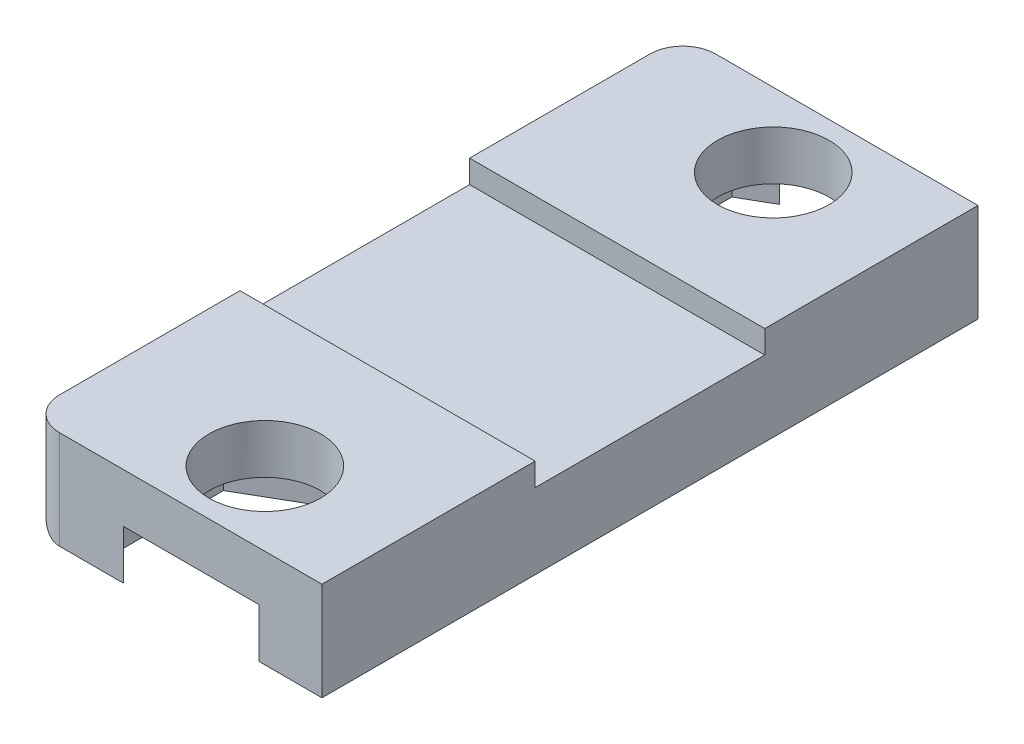
ISO-10303-21;
HEADER;
FILE_DESCRIPTION(('STEP AP214'),'2;1');
FILE_NAME('part.step','',(''),(''),'','','');
FILE_SCHEMA(('AUTOMOTIVE_DESIGN { 1 0 10303 214 1 1 1 1 }'));
ENDSEC;
DATA;
#1=APPLICATION_CONTEXT('core data for automotive mechanical design processes');
#2=APPLICATION_PROTOCOL_DEFINITION('international standard','automotive_design',2000,#1);
#3=PRODUCT_CONTEXT('',#1,'mechanical');
#4=PRODUCT('Part','Part','',(#3));
#5=PRODUCT_RELATED_PRODUCT_CATEGORY('part','',(#4));
#6=PRODUCT_DEFINITION_FORMATION('','',#4);
#7=PRODUCT_DEFINITION_CONTEXT('part definition',#1,'design');
#8=PRODUCT_DEFINITION('design','',#6,#7);
#9=PRODUCT_DEFINITION_SHAPE('','',#8);
#10=(LENGTH_UNIT() NAMED_UNIT(*) SI_UNIT(.MILLI.,.METRE.));
#11=(NAMED_UNIT(*) PLANE_ANGLE_UNIT() SI_UNIT($,.RADIAN.));
#12=(NAMED_UNIT(*) SI_UNIT($,.STERADIAN.) SOLID_ANGLE_UNIT());
#13=UNCERTAINTY_MEASURE_WITH_UNIT(LENGTH_MEASURE(1.E-05),#10,'distance_accuracy_value','');
#14=(GEOMETRIC_REPRESENTATION_CONTEXT(3) GLOBAL_UNCERTAINTY_ASSIGNED_CONTEXT((#13)) GLOBAL_UNIT_ASSIGNED_CONTEXT((#10,
#11,#12)) REPRESENTATION_CONTEXT('',''));
#15=CARTESIAN_POINT('',(0.,0.,0.));
#16=DIRECTION('',(0.,0.,1.));
#17=DIRECTION('',(1.,0.,0.));
#18=AXIS2_PLACEMENT_3D('',#15,#16,#17);
#19=CARTESIAN_POINT('',(169.955426616135,-1.,15.5));
#20=DIRECTION('',(0.,0.,1.));
#21=DIRECTION('',(1.,0.,0.));
#22=AXIS2_PLACEMENT_3D('',#19,#20,#21);
#23=PLANE('',#22);
#24=DIRECTION('',(1.,0.,0.));
#25=VECTOR('',#24,1.);
#26=CARTESIAN_POINT('',(169.954426616135,-0.7,15.5));
#27=LINE('',#26,#25);
#28=CARTESIAN_POINT('',(160.954426616135,-0.7,15.5));
#29=VERTEX_POINT('',#28);
#30=CARTESIAN_POINT('',(169.954426616135,-0.7,15.5));
#31=VERTEX_POINT('',#30);
#32=EDGE_CURVE('E55',#29,#31,#27,.T.);
#33=ORIENTED_EDGE('',*,*,#32,.F.);
#34=DIRECTION('',(0.,1.,0.));
#35=VECTOR('',#34,1.);
#36=CARTESIAN_POINT('',(160.954426616135,-1.,15.5));
#37=LINE('',#36,#35);
#38=CARTESIAN_POINT('',(160.954426616135,0.,15.5));
#39=VERTEX_POINT('',#38);
#40=EDGE_CURVE('E205',#29,#39,#37,.T.);
#41=ORIENTED_EDGE('',*,*,#40,.T.);
#42=DIRECTION('',(-1.,0.,0.));
#43=VECTOR('',#42,1.);
#44=CARTESIAN_POINT('',(169.955426616135,0.,15.5));
#45=LINE('',#44,#43);
#46=CARTESIAN_POINT('',(169.954426616135,0.,15.5));
#47=VERTEX_POINT('',#46);
#48=EDGE_CURVE('E204',#47,#39,#45,.T.);
#49=ORIENTED_EDGE('',*,*,#48,.F.);
#50=DIRECTION('',(0.,1.,0.));
#51=VECTOR('',#50,1.);
#52=CARTESIAN_POINT('',(169.954426616135,-1.,15.5));
#53=LINE('',#52,#51);
#54=EDGE_CURVE('E51',#31,#47,#53,.T.);
#55=ORIENTED_EDGE('',*,*,#54,.F.);
#56=EDGE_LOOP('',(#33,#41,#49,#55));
#57=FACE_BOUND('',#56,.T.);
#58=ADVANCED_FACE('F34',(#57),#23,.F.);
#59=CARTESIAN_POINT('',(169.955426616135,-1.,8.5));
#60=DIRECTION('',(0.,0.,-1.));
#61=DIRECTION('',(-1.,0.,0.));
#62=AXIS2_PLACEMENT_3D('',#59,#60,#61);
#63=PLANE('',#62);
#64=DIRECTION('',(-1.,0.,0.));
#65=VECTOR('',#64,1.);
#66=CARTESIAN_POINT('',(169.954426616135,-0.7,8.5));
#67=LINE('',#66,#65);
#68=CARTESIAN_POINT('',(169.954426616135,-0.7,8.5));
#69=VERTEX_POINT('',#68);
#70=CARTESIAN_POINT('',(160.954426616135,-0.7,8.5));
#71=VERTEX_POINT('',#70);
#72=EDGE_CURVE('E197',#69,#71,#67,.T.);
#73=ORIENTED_EDGE('',*,*,#72,.F.);
#74=DIRECTION('',(0.,-1.,0.));
#75=VECTOR('',#74,1.);
#76=CARTESIAN_POINT('',(169.954426616135,-1.,8.5));
#77=LINE('',#76,#75);
#78=CARTESIAN_POINT('',(169.954426616135,0.,8.5));
#79=VERTEX_POINT('',#78);
#80=EDGE_CURVE('E222',#79,#69,#77,.T.);
#81=ORIENTED_EDGE('',*,*,#80,.F.);
#82=DIRECTION('',(-1.,0.,0.));
#83=VECTOR('',#82,1.);
#84=CARTESIAN_POINT('',(169.955426616135,0.,8.5));
#85=LINE('',#84,#83);
#86=CARTESIAN_POINT('',(160.954426616135,0.,8.5));
#87=VERTEX_POINT('',#86);
#88=EDGE_CURVE('E200',#79,#87,#85,.T.);
#89=ORIENTED_EDGE('',*,*,#88,.T.);
#90=DIRECTION('',(0.,-1.,0.));
#91=VECTOR('',#90,1.);
#92=CARTESIAN_POINT('',(160.954426616135,-1.,8.5));
#93=LINE('',#92,#91);
#94=EDGE_CURVE('E194',#87,#71,#93,.T.);
#95=ORIENTED_EDGE('',*,*,#94,.T.);
#96=EDGE_LOOP('',(#73,#81,#89,#95));
#97=FACE_BOUND('',#96,.T.);
#98=ADVANCED_FACE('F196',(#97),#63,.F.);
#99=CARTESIAN_POINT('',(0.,0.,0.));
#100=DIRECTION('',(0.,1.,0.));
#101=DIRECTION('',(0.,0.,1.));
#102=AXIS2_PLACEMENT_3D('',#99,#100,#101);
#103=PLANE('',#102);
#104=DIRECTION('',(0.,0.,1.));
#105=VECTOR('',#104,1.);
#106=CARTESIAN_POINT('',(160.954426616135,0.,2.));
#107=LINE('',#106,#105);
#108=CARTESIAN_POINT('',(160.954426616135,0.,21.));
#109=VERTEX_POINT('',#108);
#110=EDGE_CURVE('E339',#39,#109,#107,.T.);
#111=ORIENTED_EDGE('',*,*,#110,.T.);
#112=CARTESIAN_POINT('',(161.954426616135,0.,21.));
#113=DIRECTION('',(0.,1.,0.));
#114=DIRECTION('',(0.,0.,1.));
#115=AXIS2_PLACEMENT_3D('',#112,#113,#114);
#116=CIRCLE('',#115,1.);
#117=CARTESIAN_POINT('',(161.954426616135,0.,22.));
#118=VERTEX_POINT('',#117);
#119=EDGE_CURVE('E43',#109,#118,#116,.T.);
#120=ORIENTED_EDGE('',*,*,#119,.T.);
#121=DIRECTION('',(1.,0.,0.));
#122=VECTOR('',#121,1.);
#123=CARTESIAN_POINT('',(160.954426616135,0.,22.));
#124=LINE('',#123,#122);
#125=CARTESIAN_POINT('',(169.954426616135,0.,22.));
#126=VERTEX_POINT('',#125);
#127=EDGE_CURVE('E353',#118,#126,#124,.T.);
#128=ORIENTED_EDGE('',*,*,#127,.T.);
#129=DIRECTION('',(0.,0.,-1.));
#130=VECTOR('',#129,1.);
#131=CARTESIAN_POINT('',(169.954426616135,0.,2.));
#132=LINE('',#131,#130);
#133=EDGE_CURVE('E356',#126,#47,#132,.T.);
#134=ORIENTED_EDGE('',*,*,#133,.T.);
#135=ORIENTED_EDGE('',*,*,#48,.T.);
#136=EDGE_LOOP('',(#111,#120,#128,#134,#135));
#137=FACE_BOUND('',#136,.T.);
#138=CARTESIAN_POINT('',(165.962302832178,0.,19.75));
#139=DIRECTION('',(0.,1.,0.));
#140=DIRECTION('',(0.,0.,1.));
#141=AXIS2_PLACEMENT_3D('',#138,#139,#140);
#142=CIRCLE('',#141,1.70000000000001);
#143=CARTESIAN_POINT('',(165.962302832178,0.,21.45));
#144=VERTEX_POINT('',#143);
#145=EDGE_CURVE('E333',#144,#144,#142,.T.);
#146=ORIENTED_EDGE('',*,*,#145,.F.);
#147=EDGE_LOOP('',(#146));
#148=FACE_BOUND('',#147,.T.);
#149=ADVANCED_FACE('F482',(#137,#148),#103,.T.);
#150=CARTESIAN_POINT('',(165.962302832178,-3.,19.75));
#151=DIRECTION('',(0.,1.,0.));
#152=DIRECTION('',(0.,0.,1.));
#153=AXIS2_PLACEMENT_3D('',#150,#151,#152);
#154=CYLINDRICAL_SURFACE('',#153,1.70000000000001);
#155=ORIENTED_EDGE('',*,*,#145,.T.);
#156=EDGE_LOOP('',(#155));
#157=FACE_BOUND('',#156,.T.);
#158=CARTESIAN_POINT('',(165.962302832178,-1.5,19.75));
#159=DIRECTION('',(0.,-1.,0.));
#160=DIRECTION('',(0.,0.,-1.));
#161=AXIS2_PLACEMENT_3D('',#158,#159,#160);
#162=CIRCLE('',#161,1.70000000000001);
#163=CARTESIAN_POINT('',(165.962302832178,-1.5,18.05));
#164=VERTEX_POINT('',#163);
#165=EDGE_CURVE('E315',#164,#164,#162,.F.);
#166=ORIENTED_EDGE('',*,*,#165,.F.);
#167=EDGE_LOOP('',(#166));
#168=FACE_BOUND('',#167,.T.);
#169=ADVANCED_FACE('F519',(#157,#168),#154,.F.);
#170=CARTESIAN_POINT('',(160.954426616135,-3.,2.));
#171=DIRECTION('',(-1.,0.,0.));
#172=DIRECTION('',(0.,0.,1.));
#173=AXIS2_PLACEMENT_3D('',#170,#171,#172);
#174=PLANE('',#173);
#175=ORIENTED_EDGE('',*,*,#40,.F.);
#176=DIRECTION('',(0.,0.,1.));
#177=VECTOR('',#176,1.);
#178=CARTESIAN_POINT('',(160.954426616135,-0.7,8.5));
#179=LINE('',#178,#177);
#180=EDGE_CURVE('E211',#71,#29,#179,.T.);
#181=ORIENTED_EDGE('',*,*,#180,.F.);
#182=ORIENTED_EDGE('',*,*,#94,.F.);
#183=CARTESIAN_POINT('',(160.954426616135,0.,3.));
#184=VERTEX_POINT('',#183);
#185=EDGE_CURVE('E351',#184,#87,#107,.T.);
#186=ORIENTED_EDGE('',*,*,#185,.F.);
#187=DIRECTION('',(0.,1.,0.));
#188=VECTOR('',#187,1.);
#189=CARTESIAN_POINT('',(160.954426616135,-3.,3.));
#190=LINE('',#189,#188);
#191=CARTESIAN_POINT('',(160.954426616135,-2.,3.));
#192=VERTEX_POINT('',#191);
#193=EDGE_CURVE('E376',#184,#192,#190,.F.);
#194=ORIENTED_EDGE('',*,*,#193,.T.);
#195=DIRECTION('',(0.,0.,1.));
#196=VECTOR('',#195,1.);
#197=CARTESIAN_POINT('',(160.954426616135,-2.,22.));
#198=LINE('',#197,#196);
#199=CARTESIAN_POINT('',(160.954426616135,-2.,21.));
#200=VERTEX_POINT('',#199);
#201=EDGE_CURVE('E373',#192,#200,#198,.T.);
#202=ORIENTED_EDGE('',*,*,#201,.T.);
#203=DIRECTION('',(0.,1.,0.));
#204=VECTOR('',#203,1.);
#205=CARTESIAN_POINT('',(160.954426616135,-3.,21.));
#206=LINE('',#205,#204);
#207=EDGE_CURVE('E365',#200,#109,#206,.T.);
#208=ORIENTED_EDGE('',*,*,#207,.T.);
#209=ORIENTED_EDGE('',*,*,#110,.F.);
#210=EDGE_LOOP('',(#175,#181,#182,#186,#194,#202,#208,#209));
#211=FACE_BOUND('',#210,.T.);
#212=ADVANCED_FACE('F215',(#211),#174,.T.);
#213=CARTESIAN_POINT('',(160.954426616135,-3.,2.));
#214=DIRECTION('',(0.,0.,-1.));
#215=DIRECTION('',(-1.,0.,0.));
#216=AXIS2_PLACEMENT_3D('',#213,#214,#215);
#217=PLANE('',#216);
#218=DIRECTION('',(-1.,0.,0.));
#219=VECTOR('',#218,1.);
#220=CARTESIAN_POINT('',(160.954426616135,-3.,2.));
#221=LINE('',#220,#219);
#222=CARTESIAN_POINT('',(163.896382905633,-3.,2.));
#223=VERTEX_POINT('',#222);
#224=CARTESIAN_POINT('',(161.954426616135,-3.,2.));
#225=VERTEX_POINT('',#224);
#226=EDGE_CURVE('E346',#223,#225,#221,.T.);
#227=ORIENTED_EDGE('',*,*,#226,.T.);
#228=DIRECTION('',(0.,1.,0.));
#229=VECTOR('',#228,1.);
#230=CARTESIAN_POINT('',(161.954426616135,-3.,2.));
#231=LINE('',#230,#229);
#232=CARTESIAN_POINT('',(161.954426616135,0.,2.));
#233=VERTEX_POINT('',#232);
#234=EDGE_CURVE('E380',#225,#233,#231,.T.);
#235=ORIENTED_EDGE('',*,*,#234,.T.);
#236=DIRECTION('',(-1.,0.,0.));
#237=VECTOR('',#236,1.);
#238=CARTESIAN_POINT('',(160.954426616135,0.,2.));
#239=LINE('',#238,#237);
#240=CARTESIAN_POINT('',(169.954426616135,0.,2.));
#241=VERTEX_POINT('',#240);
#242=EDGE_CURVE('E359',#241,#233,#239,.T.);
#243=ORIENTED_EDGE('',*,*,#242,.F.);
#244=DIRECTION('',(0.,1.,0.));
#245=VECTOR('',#244,1.);
#246=CARTESIAN_POINT('',(169.954426616135,-3.,2.));
#247=LINE('',#246,#245);
#248=CARTESIAN_POINT('',(169.954426616135,-3.,2.));
#249=VERTEX_POINT('',#248);
#250=EDGE_CURVE('E362',#249,#241,#247,.T.);
#251=ORIENTED_EDGE('',*,*,#250,.F.);
#252=CARTESIAN_POINT('',(168.028222758723,-3.,2.00000000000001));
#253=VERTEX_POINT('',#252);
#254=EDGE_CURVE('E347',#249,#253,#221,.T.);
#255=ORIENTED_EDGE('',*,*,#254,.T.);
#256=DIRECTION('',(0.,-1.,0.));
#257=VECTOR('',#256,1.);
#258=CARTESIAN_POINT('',(168.028222758723,-3.,2.));
#259=LINE('',#258,#257);
#260=CARTESIAN_POINT('',(168.028222758723,-1.5,2.));
#261=VERTEX_POINT('',#260);
#262=EDGE_CURVE('E278',#261,#253,#259,.T.);
#263=ORIENTED_EDGE('',*,*,#262,.F.);
#264=DIRECTION('',(1.,0.,0.));
#265=VECTOR('',#264,1.);
#266=CARTESIAN_POINT('',(160.954426616135,-1.5,2.));
#267=LINE('',#266,#265);
#268=CARTESIAN_POINT('',(163.896382905633,-1.5,2.));
#269=VERTEX_POINT('',#268);
#270=EDGE_CURVE('E274',#269,#261,#267,.T.);
#271=ORIENTED_EDGE('',*,*,#270,.F.);
#272=DIRECTION('',(0.,1.,0.));
#273=VECTOR('',#272,1.);
#274=CARTESIAN_POINT('',(163.896382905633,-3.,2.));
#275=LINE('',#274,#273);
#276=EDGE_CURVE('E276',#223,#269,#275,.T.);
#277=ORIENTED_EDGE('',*,*,#276,.F.);
#278=EDGE_LOOP('',(#227,#235,#243,#251,#255,#263,#271,#277));
#279=FACE_BOUND('',#278,.T.);
#280=ADVANCED_FACE('F399',(#279),#217,.T.);
#281=CARTESIAN_POINT('',(169.954426616135,-3.,2.));
#282=DIRECTION('',(1.,0.,0.));
#283=DIRECTION('',(0.,0.,-1.));
#284=AXIS2_PLACEMENT_3D('',#281,#282,#283);
#285=PLANE('',#284);
#286=DIRECTION('',(0.,0.,-1.));
#287=VECTOR('',#286,1.);
#288=CARTESIAN_POINT('',(169.954426616135,-0.7,8.5));
#289=LINE('',#288,#287);
#290=EDGE_CURVE('E213',#31,#69,#289,.T.);
#291=ORIENTED_EDGE('',*,*,#290,.F.);
#292=ORIENTED_EDGE('',*,*,#54,.T.);
#293=ORIENTED_EDGE('',*,*,#133,.F.);
#294=DIRECTION('',(0.,1.,0.));
#295=VECTOR('',#294,1.);
#296=CARTESIAN_POINT('',(169.954426616135,-3.,22.));
#297=LINE('',#296,#295);
#298=CARTESIAN_POINT('',(169.954426616135,-3.,22.));
#299=VERTEX_POINT('',#298);
#300=EDGE_CURVE('E350',#299,#126,#297,.T.);
#301=ORIENTED_EDGE('',*,*,#300,.F.);
#302=DIRECTION('',(0.,0.,-1.));
#303=VECTOR('',#302,1.);
#304=CARTESIAN_POINT('',(169.954426616135,-3.,2.));
#305=LINE('',#304,#303);
#306=EDGE_CURVE('E342',#299,#249,#305,.T.);
#307=ORIENTED_EDGE('',*,*,#306,.T.);
#308=ORIENTED_EDGE('',*,*,#250,.T.);
#309=EDGE_CURVE('E355',#79,#241,#132,.T.);
#310=ORIENTED_EDGE('',*,*,#309,.F.);
#311=ORIENTED_EDGE('',*,*,#80,.T.);
#312=EDGE_LOOP('',(#291,#292,#293,#301,#307,#308,#310,#311));
#313=FACE_BOUND('',#312,.T.);
#314=ADVANCED_FACE('F407',(#313),#285,.T.);
#315=CARTESIAN_POINT('',(160.954426616135,-3.,22.));
#316=DIRECTION('',(0.,0.,1.));
#317=DIRECTION('',(1.,0.,0.));
#318=AXIS2_PLACEMENT_3D('',#315,#316,#317);
#319=PLANE('',#318);
#320=ORIENTED_EDGE('',*,*,#127,.F.);
#321=DIRECTION('',(0.,1.,0.));
#322=VECTOR('',#321,1.);
#323=CARTESIAN_POINT('',(161.954426616135,-3.,22.));
#324=LINE('',#323,#322);
#325=CARTESIAN_POINT('',(161.954426616135,-3.,22.));
#326=VERTEX_POINT('',#325);
#327=EDGE_CURVE('E11',#118,#326,#324,.F.);
#328=ORIENTED_EDGE('',*,*,#327,.T.);
#329=DIRECTION('',(1.,0.,0.));
#330=VECTOR('',#329,1.);
#331=CARTESIAN_POINT('',(160.954426616135,-3.,22.));
#332=LINE('',#331,#330);
#333=CARTESIAN_POINT('',(163.896382905633,-3.,22.));
#334=VERTEX_POINT('',#333);
#335=EDGE_CURVE('E340',#326,#334,#332,.T.);
#336=ORIENTED_EDGE('',*,*,#335,.T.);
#337=DIRECTION('',(0.,-1.,0.));
#338=VECTOR('',#337,1.);
#339=CARTESIAN_POINT('',(163.896382905633,-3.,22.));
#340=LINE('',#339,#338);
#341=CARTESIAN_POINT('',(163.896382905633,-1.5,22.));
#342=VERTEX_POINT('',#341);
#343=EDGE_CURVE('E330',#342,#334,#340,.T.);
#344=ORIENTED_EDGE('',*,*,#343,.F.);
#345=DIRECTION('',(1.,0.,0.));
#346=VECTOR('',#345,1.);
#347=CARTESIAN_POINT('',(160.954426616135,-1.5,22.));
#348=LINE('',#347,#346);
#349=CARTESIAN_POINT('',(168.028222758723,-1.5,22.));
#350=VERTEX_POINT('',#349);
#351=EDGE_CURVE('E325',#342,#350,#348,.T.);
#352=ORIENTED_EDGE('',*,*,#351,.T.);
#353=DIRECTION('',(0.,1.,0.));
#354=VECTOR('',#353,1.);
#355=CARTESIAN_POINT('',(168.028222758723,-3.,22.));
#356=LINE('',#355,#354);
#357=CARTESIAN_POINT('',(168.028222758723,-3.,22.));
#358=VERTEX_POINT('',#357);
#359=EDGE_CURVE('E328',#358,#350,#356,.T.);
#360=ORIENTED_EDGE('',*,*,#359,.F.);
#361=EDGE_CURVE('E343',#358,#299,#332,.T.);
#362=ORIENTED_EDGE('',*,*,#361,.T.);
#363=ORIENTED_EDGE('',*,*,#300,.T.);
#364=EDGE_LOOP('',(#320,#328,#336,#344,#352,#360,#362,#363));
#365=FACE_BOUND('',#364,.T.);
#366=ADVANCED_FACE('F440',(#365),#319,.T.);
#367=CARTESIAN_POINT('',(0.,-3.,0.));
#368=DIRECTION('',(0.,1.,0.));
#369=DIRECTION('',(0.,0.,1.));
#370=AXIS2_PLACEMENT_3D('',#367,#368,#369);
#371=PLANE('',#370);
#372=ORIENTED_EDGE('',*,*,#335,.F.);
#373=DIRECTION('',(0.,0.,1.));
#374=VECTOR('',#373,1.);
#375=CARTESIAN_POINT('',(161.954426616135,-3.,2.));
#376=LINE('',#375,#374);
#377=EDGE_CURVE('E378',#326,#225,#376,.F.);
#378=ORIENTED_EDGE('',*,*,#377,.T.);
#379=ORIENTED_EDGE('',*,*,#226,.F.);
#380=DIRECTION('',(0.86602540378444,0.,-0.499999999999998));
#381=VECTOR('',#380,1.);
#382=CARTESIAN_POINT('',(165.962302832178,-3.,0.80724057428494));
#383=LINE('',#382,#381);
#384=CARTESIAN_POINT('',(162.98078571039,-3.,2.52862028714248));
#385=VERTEX_POINT('',#384);
#386=EDGE_CURVE('E256',#385,#223,#383,.T.);
#387=ORIENTED_EDGE('',*,*,#386,.F.);
#388=DIRECTION('',(0.,0.,-1.));
#389=VECTOR('',#388,1.);
#390=CARTESIAN_POINT('',(162.98078571039,-3.,2.52862028714248));
#391=LINE('',#390,#389);
#392=CARTESIAN_POINT('',(162.98078571039,-3.,5.97137971285751));
#393=VERTEX_POINT('',#392);
#394=EDGE_CURVE('E253',#393,#385,#391,.T.);
#395=ORIENTED_EDGE('',*,*,#394,.F.);
#396=DIRECTION('',(-0.866025403784439,0.,-0.5));
#397=VECTOR('',#396,1.);
#398=CARTESIAN_POINT('',(162.98078571039,-3.,5.97137971285751));
#399=LINE('',#398,#397);
#400=CARTESIAN_POINT('',(165.962302832178,-3.,7.69275942571507));
#401=VERTEX_POINT('',#400);
#402=EDGE_CURVE('E250',#401,#393,#399,.T.);
#403=ORIENTED_EDGE('',*,*,#402,.F.);
#404=DIRECTION('',(-0.866025403784439,0.,0.5));
#405=VECTOR('',#404,1.);
#406=CARTESIAN_POINT('',(165.962302832178,-3.,7.69275942571506));
#407=LINE('',#406,#405);
#408=CARTESIAN_POINT('',(168.943819953965,-3.,5.97137971285753));
#409=VERTEX_POINT('',#408);
#410=EDGE_CURVE('E227',#409,#401,#407,.T.);
#411=ORIENTED_EDGE('',*,*,#410,.F.);
#412=DIRECTION('',(0.,0.,1.));
#413=VECTOR('',#412,1.);
#414=CARTESIAN_POINT('',(168.943819953965,-3.,5.97137971285753));
#415=LINE('',#414,#413);
#416=CARTESIAN_POINT('',(168.943819953965,-3.,2.52862028714248));
#417=VERTEX_POINT('',#416);
#418=EDGE_CURVE('E234',#417,#409,#415,.T.);
#419=ORIENTED_EDGE('',*,*,#418,.F.);
#420=DIRECTION('',(0.866025403784438,0.,0.500000000000001));
#421=VECTOR('',#420,1.);
#422=CARTESIAN_POINT('',(168.943819953965,-3.,2.52862028714248));
#423=LINE('',#422,#421);
#424=EDGE_CURVE('E258',#253,#417,#423,.T.);
#425=ORIENTED_EDGE('',*,*,#424,.F.);
#426=ORIENTED_EDGE('',*,*,#254,.F.);
#427=ORIENTED_EDGE('',*,*,#306,.F.);
#428=ORIENTED_EDGE('',*,*,#361,.F.);
#429=DIRECTION('',(-0.866025403784438,0.,0.500000000000001));
#430=VECTOR('',#429,1.);
#431=CARTESIAN_POINT('',(168.943819953965,-3.,21.4713797128575));
#432=LINE('',#431,#430);
#433=CARTESIAN_POINT('',(168.943819953965,-3.,21.4713797128575));
#434=VERTEX_POINT('',#433);
#435=EDGE_CURVE('E301',#434,#358,#432,.T.);
#436=ORIENTED_EDGE('',*,*,#435,.F.);
#437=DIRECTION('',(0.,0.,1.));
#438=VECTOR('',#437,1.);
#439=CARTESIAN_POINT('',(168.943819953965,-3.,18.0286202871425));
#440=LINE('',#439,#438);
#441=CARTESIAN_POINT('',(168.943819953965,-3.,18.0286202871425));
#442=VERTEX_POINT('',#441);
#443=EDGE_CURVE('E280',#442,#434,#440,.T.);
#444=ORIENTED_EDGE('',*,*,#443,.F.);
#445=DIRECTION('',(0.866025403784439,0.,0.5));
#446=VECTOR('',#445,1.);
#447=CARTESIAN_POINT('',(165.962302832178,-3.,16.3072405742849));
#448=LINE('',#447,#446);
#449=CARTESIAN_POINT('',(165.962302832178,-3.,16.3072405742849));
#450=VERTEX_POINT('',#449);
#451=EDGE_CURVE('E285',#450,#442,#448,.T.);
#452=ORIENTED_EDGE('',*,*,#451,.F.);
#453=DIRECTION('',(0.866025403784439,0.,-0.5));
#454=VECTOR('',#453,1.);
#455=CARTESIAN_POINT('',(162.98078571039,-3.,18.0286202871425));
#456=LINE('',#455,#454);
#457=CARTESIAN_POINT('',(162.98078571039,-3.,18.0286202871425));
#458=VERTEX_POINT('',#457);
#459=EDGE_CURVE('E308',#458,#450,#456,.T.);
#460=ORIENTED_EDGE('',*,*,#459,.F.);
#461=DIRECTION('',(0.,0.,-1.));
#462=VECTOR('',#461,1.);
#463=CARTESIAN_POINT('',(162.98078571039,-3.,21.4713797128575));
#464=LINE('',#463,#462);
#465=CARTESIAN_POINT('',(162.98078571039,-3.,21.4713797128575));
#466=VERTEX_POINT('',#465);
#467=EDGE_CURVE('E305',#466,#458,#464,.T.);
#468=ORIENTED_EDGE('',*,*,#467,.F.);
#469=DIRECTION('',(-0.86602540378444,0.,-0.499999999999998));
#470=VECTOR('',#469,1.);
#471=CARTESIAN_POINT('',(165.962302832178,-3.,23.1927594257151));
#472=LINE('',#471,#470);
#473=EDGE_CURVE('E303',#334,#466,#472,.T.);
#474=ORIENTED_EDGE('',*,*,#473,.F.);
#475=EDGE_LOOP('',(#372,#378,#379,#387,#395,#403,#411,#419,#425,#426,#427,#428,#436,#444,#452,
#460,#468,#474));
#476=FACE_BOUND('',#475,.T.);
#477=ADVANCED_FACE('F416',(#476),#371,.F.);
#478=ORIENTED_EDGE('',*,*,#242,.T.);
#479=CARTESIAN_POINT('',(161.954426616135,0.,3.));
#480=DIRECTION('',(0.,1.,0.));
#481=DIRECTION('',(0.,0.,1.));
#482=AXIS2_PLACEMENT_3D('',#479,#480,#481);
#483=CIRCLE('',#482,1.);
#484=EDGE_CURVE('E382',#233,#184,#483,.T.);
#485=ORIENTED_EDGE('',*,*,#484,.T.);
#486=ORIENTED_EDGE('',*,*,#185,.T.);
#487=ORIENTED_EDGE('',*,*,#88,.F.);
#488=ORIENTED_EDGE('',*,*,#309,.T.);
#489=EDGE_LOOP('',(#478,#485,#486,#487,#488));
#490=FACE_BOUND('',#489,.T.);
#491=CARTESIAN_POINT('',(165.962302832178,0.,4.24999999999999));
#492=DIRECTION('',(0.,1.,0.));
#493=DIRECTION('',(0.,0.,1.));
#494=AXIS2_PLACEMENT_3D('',#491,#492,#493);
#495=CIRCLE('',#494,1.70000000000001);
#496=CARTESIAN_POINT('',(165.962302832178,0.,5.95));
#497=VERTEX_POINT('',#496);
#498=EDGE_CURVE('E336',#497,#497,#495,.T.);
#499=ORIENTED_EDGE('',*,*,#498,.F.);
#500=EDGE_LOOP('',(#499));
#501=FACE_BOUND('',#500,.T.);
#502=ADVANCED_FACE('F403',(#490,#501),#103,.T.);
#503=CARTESIAN_POINT('',(165.962302832178,-3.,4.24999999999999));
#504=DIRECTION('',(0.,1.,0.));
#505=DIRECTION('',(0.,0.,1.));
#506=AXIS2_PLACEMENT_3D('',#503,#504,#505);
#507=CYLINDRICAL_SURFACE('',#506,1.70000000000001);
#508=CARTESIAN_POINT('',(165.962302832178,-1.5,4.24999999999999));
#509=DIRECTION('',(0.,1.,0.));
#510=DIRECTION('',(0.,0.,1.));
#511=AXIS2_PLACEMENT_3D('',#508,#509,#510);
#512=CIRCLE('',#511,1.70000000000001);
#513=CARTESIAN_POINT('',(165.962302832178,-1.5,5.95));
#514=VERTEX_POINT('',#513);
#515=EDGE_CURVE('E264',#514,#514,#512,.F.);
#516=ORIENTED_EDGE('',*,*,#515,.T.);
#517=EDGE_LOOP('',(#516));
#518=FACE_BOUND('',#517,.T.);
#519=ORIENTED_EDGE('',*,*,#498,.T.);
#520=EDGE_LOOP('',(#519));
#521=FACE_BOUND('',#520,.T.);
#522=ADVANCED_FACE('F509',(#518,#521),#507,.F.);
#523=CARTESIAN_POINT('',(0.,-1.5,0.));
#524=DIRECTION('',(0.,-1.,0.));
#525=DIRECTION('',(0.,0.,-1.));
#526=AXIS2_PLACEMENT_3D('',#523,#524,#525);
#527=PLANE('',#526);
#528=DIRECTION('',(-0.86602540378444,0.,-0.499999999999998));
#529=VECTOR('',#528,1.);
#530=CARTESIAN_POINT('',(165.962302832178,-1.5,23.1927594257151));
#531=LINE('',#530,#529);
#532=CARTESIAN_POINT('',(162.98078571039,-1.5,21.4713797128575));
#533=VERTEX_POINT('',#532);
#534=EDGE_CURVE('E288',#342,#533,#531,.T.);
#535=ORIENTED_EDGE('',*,*,#534,.T.);
#536=DIRECTION('',(0.,0.,-1.));
#537=VECTOR('',#536,1.);
#538=CARTESIAN_POINT('',(162.98078571039,-1.5,21.4713797128575));
#539=LINE('',#538,#537);
#540=CARTESIAN_POINT('',(162.98078571039,-1.5,18.0286202871425));
#541=VERTEX_POINT('',#540);
#542=EDGE_CURVE('E290',#533,#541,#539,.T.);
#543=ORIENTED_EDGE('',*,*,#542,.T.);
#544=DIRECTION('',(0.866025403784439,0.,-0.5));
#545=VECTOR('',#544,1.);
#546=CARTESIAN_POINT('',(162.98078571039,-1.5,18.0286202871425));
#547=LINE('',#546,#545);
#548=CARTESIAN_POINT('',(165.962302832178,-1.5,16.3072405742849));
#549=VERTEX_POINT('',#548);
#550=EDGE_CURVE('E293',#541,#549,#547,.T.);
#551=ORIENTED_EDGE('',*,*,#550,.T.);
#552=DIRECTION('',(0.866025403784439,0.,0.5));
#553=VECTOR('',#552,1.);
#554=CARTESIAN_POINT('',(165.962302832178,-1.5,16.3072405742849));
#555=LINE('',#554,#553);
#556=CARTESIAN_POINT('',(168.943819953965,-1.5,18.0286202871425));
#557=VERTEX_POINT('',#556);
#558=EDGE_CURVE('E296',#549,#557,#555,.T.);
#559=ORIENTED_EDGE('',*,*,#558,.T.);
#560=DIRECTION('',(0.,0.,1.));
#561=VECTOR('',#560,1.);
#562=CARTESIAN_POINT('',(168.943819953965,-1.5,18.0286202871425));
#563=LINE('',#562,#561);
#564=CARTESIAN_POINT('',(168.943819953965,-1.5,21.4713797128575));
#565=VERTEX_POINT('',#564);
#566=EDGE_CURVE('E281',#557,#565,#563,.T.);
#567=ORIENTED_EDGE('',*,*,#566,.T.);
#568=DIRECTION('',(-0.866025403784438,0.,0.500000000000001));
#569=VECTOR('',#568,1.);
#570=CARTESIAN_POINT('',(168.943819953965,-1.5,21.4713797128575));
#571=LINE('',#570,#569);
#572=EDGE_CURVE('E284',#565,#350,#571,.T.);
#573=ORIENTED_EDGE('',*,*,#572,.T.);
#574=ORIENTED_EDGE('',*,*,#351,.F.);
#575=EDGE_LOOP('',(#535,#543,#551,#559,#567,#573,#574));
#576=FACE_BOUND('',#575,.T.);
#577=ORIENTED_EDGE('',*,*,#165,.T.);
#578=EDGE_LOOP('',(#577));
#579=FACE_BOUND('',#578,.T.);
#580=ADVANCED_FACE('F448',(#576,#579),#527,.T.);
#581=CARTESIAN_POINT('',(168.943819953965,-1.5,18.0286202871425));
#582=DIRECTION('',(1.,0.,0.));
#583=DIRECTION('',(0.,0.,-1.));
#584=AXIS2_PLACEMENT_3D('',#581,#582,#583);
#585=PLANE('',#584);
#586=ORIENTED_EDGE('',*,*,#443,.T.);
#587=DIRECTION('',(0.,-1.,0.));
#588=VECTOR('',#587,1.);
#589=CARTESIAN_POINT('',(168.943819953965,-1.5,21.4713797128575));
#590=LINE('',#589,#588);
#591=EDGE_CURVE('E299',#565,#434,#590,.T.);
#592=ORIENTED_EDGE('',*,*,#591,.F.);
#593=ORIENTED_EDGE('',*,*,#566,.F.);
#594=DIRECTION('',(0.,-1.,0.));
#595=VECTOR('',#594,1.);
#596=CARTESIAN_POINT('',(168.943819953965,-1.5,18.0286202871425));
#597=LINE('',#596,#595);
#598=EDGE_CURVE('E313',#557,#442,#597,.T.);
#599=ORIENTED_EDGE('',*,*,#598,.T.);
#600=EDGE_LOOP('',(#586,#592,#593,#599));
#601=FACE_BOUND('',#600,.T.);
#602=ADVANCED_FACE('F459',(#601),#585,.F.);
#603=CARTESIAN_POINT('',(165.962302832178,-1.5,16.3072405742849));
#604=DIRECTION('',(0.5,0.,-0.866025403784438));
#605=DIRECTION('',(-0.866025403784439,0.,-0.5));
#606=AXIS2_PLACEMENT_3D('',#603,#604,#605);
#607=PLANE('',#606);
#608=ORIENTED_EDGE('',*,*,#451,.T.);
#609=ORIENTED_EDGE('',*,*,#598,.F.);
#610=ORIENTED_EDGE('',*,*,#558,.F.);
#611=DIRECTION('',(0.,-1.,0.));
#612=VECTOR('',#611,1.);
#613=CARTESIAN_POINT('',(165.962302832178,-1.5,16.3072405742849));
#614=LINE('',#613,#612);
#615=EDGE_CURVE('E316',#549,#450,#614,.T.);
#616=ORIENTED_EDGE('',*,*,#615,.T.);
#617=EDGE_LOOP('',(#608,#609,#610,#616));
#618=FACE_BOUND('',#617,.T.);
#619=ADVANCED_FACE('F462',(#618),#607,.F.);
#620=CARTESIAN_POINT('',(162.98078571039,-1.5,18.0286202871425));
#621=DIRECTION('',(-0.5,0.,-0.866025403784439));
#622=DIRECTION('',(-0.866025403784439,0.,0.5));
#623=AXIS2_PLACEMENT_3D('',#620,#621,#622);
#624=PLANE('',#623);
#625=ORIENTED_EDGE('',*,*,#459,.T.);
#626=ORIENTED_EDGE('',*,*,#615,.F.);
#627=ORIENTED_EDGE('',*,*,#550,.F.);
#628=DIRECTION('',(0.,-1.,0.));
#629=VECTOR('',#628,1.);
#630=CARTESIAN_POINT('',(162.98078571039,-1.5,18.0286202871425));
#631=LINE('',#630,#629);
#632=EDGE_CURVE('E318',#541,#458,#631,.T.);
#633=ORIENTED_EDGE('',*,*,#632,.T.);
#634=EDGE_LOOP('',(#625,#626,#627,#633));
#635=FACE_BOUND('',#634,.T.);
#636=ADVANCED_FACE('F465',(#635),#624,.F.);
#637=CARTESIAN_POINT('',(162.98078571039,-1.5,21.4713797128575));
#638=DIRECTION('',(-1.,0.,0.));
#639=DIRECTION('',(0.,0.,1.));
#640=AXIS2_PLACEMENT_3D('',#637,#638,#639);
#641=PLANE('',#640);
#642=ORIENTED_EDGE('',*,*,#467,.T.);
#643=ORIENTED_EDGE('',*,*,#632,.F.);
#644=ORIENTED_EDGE('',*,*,#542,.F.);
#645=DIRECTION('',(0.,-1.,0.));
#646=VECTOR('',#645,1.);
#647=CARTESIAN_POINT('',(162.98078571039,-1.5,21.4713797128575));
#648=LINE('',#647,#646);
#649=EDGE_CURVE('E320',#533,#466,#648,.T.);
#650=ORIENTED_EDGE('',*,*,#649,.T.);
#651=EDGE_LOOP('',(#642,#643,#644,#650));
#652=FACE_BOUND('',#651,.T.);
#653=ADVANCED_FACE('F468',(#652),#641,.F.);
#654=CARTESIAN_POINT('',(165.962302832178,-1.5,23.1927594257151));
#655=DIRECTION('',(-0.499999999999998,0.,0.86602540378444));
#656=DIRECTION('',(0.86602540378444,0.,0.499999999999998));
#657=AXIS2_PLACEMENT_3D('',#654,#655,#656);
#658=PLANE('',#657);
#659=ORIENTED_EDGE('',*,*,#343,.T.);
#660=ORIENTED_EDGE('',*,*,#473,.T.);
#661=ORIENTED_EDGE('',*,*,#649,.F.);
#662=ORIENTED_EDGE('',*,*,#534,.F.);
#663=EDGE_LOOP('',(#659,#660,#661,#662));
#664=FACE_BOUND('',#663,.T.);
#665=ADVANCED_FACE('F444',(#664),#658,.F.);
#666=CARTESIAN_POINT('',(168.943819953965,-1.5,21.4713797128575));
#667=DIRECTION('',(0.500000000000001,0.,0.866025403784438));
#668=DIRECTION('',(0.866025403784438,0.,-0.500000000000001));
#669=AXIS2_PLACEMENT_3D('',#666,#667,#668);
#670=PLANE('',#669);
#671=ORIENTED_EDGE('',*,*,#359,.T.);
#672=ORIENTED_EDGE('',*,*,#572,.F.);
#673=ORIENTED_EDGE('',*,*,#591,.T.);
#674=ORIENTED_EDGE('',*,*,#435,.T.);
#675=EDGE_LOOP('',(#671,#672,#673,#674));
#676=FACE_BOUND('',#675,.T.);
#677=ADVANCED_FACE('F456',(#676),#670,.F.);
#678=CARTESIAN_POINT('',(0.,-1.5,0.));
#679=DIRECTION('',(0.,1.,0.));
#680=DIRECTION('',(0.,0.,1.));
#681=AXIS2_PLACEMENT_3D('',#678,#679,#680);
#682=PLANE('',#681);
#683=ORIENTED_EDGE('',*,*,#270,.T.);
#684=DIRECTION('',(0.866025403784438,0.,0.500000000000001));
#685=VECTOR('',#684,1.);
#686=CARTESIAN_POINT('',(168.943819953965,-1.5,2.52862028714248));
#687=LINE('',#686,#685);
#688=CARTESIAN_POINT('',(168.943819953965,-1.5,2.52862028714248));
#689=VERTEX_POINT('',#688);
#690=EDGE_CURVE('E243',#261,#689,#687,.T.);
#691=ORIENTED_EDGE('',*,*,#690,.T.);
#692=DIRECTION('',(0.,0.,1.));
#693=VECTOR('',#692,1.);
#694=CARTESIAN_POINT('',(168.943819953965,-1.5,5.97137971285753));
#695=LINE('',#694,#693);
#696=CARTESIAN_POINT('',(168.943819953965,-1.5,5.97137971285753));
#697=VERTEX_POINT('',#696);
#698=EDGE_CURVE('E245',#689,#697,#695,.T.);
#699=ORIENTED_EDGE('',*,*,#698,.T.);
#700=DIRECTION('',(-0.866025403784439,0.,0.5));
#701=VECTOR('',#700,1.);
#702=CARTESIAN_POINT('',(165.962302832178,-1.5,7.69275942571506));
#703=LINE('',#702,#701);
#704=CARTESIAN_POINT('',(165.962302832178,-1.5,7.69275942571506));
#705=VERTEX_POINT('',#704);
#706=EDGE_CURVE('E230',#697,#705,#703,.T.);
#707=ORIENTED_EDGE('',*,*,#706,.T.);
#708=DIRECTION('',(-0.866025403784439,0.,-0.5));
#709=VECTOR('',#708,1.);
#710=CARTESIAN_POINT('',(162.98078571039,-1.5,5.97137971285751));
#711=LINE('',#710,#709);
#712=CARTESIAN_POINT('',(162.98078571039,-1.5,5.97137971285751));
#713=VERTEX_POINT('',#712);
#714=EDGE_CURVE('E233',#705,#713,#711,.T.);
#715=ORIENTED_EDGE('',*,*,#714,.T.);
#716=DIRECTION('',(0.,0.,-1.));
#717=VECTOR('',#716,1.);
#718=CARTESIAN_POINT('',(162.98078571039,-1.5,2.52862028714248));
#719=LINE('',#718,#717);
#720=CARTESIAN_POINT('',(162.98078571039,-1.5,2.52862028714248));
#721=VERTEX_POINT('',#720);
#722=EDGE_CURVE('E237',#713,#721,#719,.T.);
#723=ORIENTED_EDGE('',*,*,#722,.T.);
#724=DIRECTION('',(0.86602540378444,0.,-0.499999999999998));
#725=VECTOR('',#724,1.);
#726=CARTESIAN_POINT('',(165.962302832178,-1.5,0.80724057428494));
#727=LINE('',#726,#725);
#728=EDGE_CURVE('E240',#721,#269,#727,.T.);
#729=ORIENTED_EDGE('',*,*,#728,.T.);
#730=EDGE_LOOP('',(#683,#691,#699,#707,#715,#723,#729));
#731=FACE_BOUND('',#730,.T.);
#732=ORIENTED_EDGE('',*,*,#515,.F.);
#733=EDGE_LOOP('',(#732));
#734=FACE_BOUND('',#733,.T.);
#735=ADVANCED_FACE('F429',(#731,#734),#682,.F.);
#736=CARTESIAN_POINT('',(165.962302832178,-1.5,7.69275942571506));
#737=DIRECTION('',(0.5,0.,0.866025403784438));
#738=DIRECTION('',(0.866025403784439,0.,-0.5));
#739=AXIS2_PLACEMENT_3D('',#736,#737,#738);
#740=PLANE('',#739);
#741=ORIENTED_EDGE('',*,*,#410,.T.);
#742=DIRECTION('',(0.,-1.,0.));
#743=VECTOR('',#742,1.);
#744=CARTESIAN_POINT('',(165.962302832178,-1.5,7.69275942571506));
#745=LINE('',#744,#743);
#746=EDGE_CURVE('E248',#705,#401,#745,.T.);
#747=ORIENTED_EDGE('',*,*,#746,.F.);
#748=ORIENTED_EDGE('',*,*,#706,.F.);
#749=DIRECTION('',(0.,-1.,0.));
#750=VECTOR('',#749,1.);
#751=CARTESIAN_POINT('',(168.943819953965,-1.5,5.97137971285753));
#752=LINE('',#751,#750);
#753=EDGE_CURVE('E262',#697,#409,#752,.T.);
#754=ORIENTED_EDGE('',*,*,#753,.T.);
#755=EDGE_LOOP('',(#741,#747,#748,#754));
#756=FACE_BOUND('',#755,.T.);
#757=ADVANCED_FACE('F488',(#756),#740,.F.);
#758=CARTESIAN_POINT('',(168.943819953965,-1.5,5.97137971285753));
#759=DIRECTION('',(1.,0.,0.));
#760=DIRECTION('',(0.,0.,-1.));
#761=AXIS2_PLACEMENT_3D('',#758,#759,#760);
#762=PLANE('',#761);
#763=ORIENTED_EDGE('',*,*,#418,.T.);
#764=ORIENTED_EDGE('',*,*,#753,.F.);
#765=ORIENTED_EDGE('',*,*,#698,.F.);
#766=DIRECTION('',(0.,-1.,0.));
#767=VECTOR('',#766,1.);
#768=CARTESIAN_POINT('',(168.943819953965,-1.5,2.52862028714248));
#769=LINE('',#768,#767);
#770=EDGE_CURVE('E265',#689,#417,#769,.T.);
#771=ORIENTED_EDGE('',*,*,#770,.T.);
#772=EDGE_LOOP('',(#763,#764,#765,#771));
#773=FACE_BOUND('',#772,.T.);
#774=ADVANCED_FACE('F426',(#773),#762,.F.);
#775=CARTESIAN_POINT('',(168.943819953965,-1.5,2.52862028714248));
#776=DIRECTION('',(0.500000000000001,0.,-0.866025403784438));
#777=DIRECTION('',(-0.866025403784438,0.,-0.500000000000001));
#778=AXIS2_PLACEMENT_3D('',#775,#776,#777);
#779=PLANE('',#778);
#780=ORIENTED_EDGE('',*,*,#262,.T.);
#781=ORIENTED_EDGE('',*,*,#424,.T.);
#782=ORIENTED_EDGE('',*,*,#770,.F.);
#783=ORIENTED_EDGE('',*,*,#690,.F.);
#784=EDGE_LOOP('',(#780,#781,#782,#783));
#785=FACE_BOUND('',#784,.T.);
#786=ADVANCED_FACE('F422',(#785),#779,.F.);
#787=CARTESIAN_POINT('',(165.962302832178,-1.5,0.80724057428494));
#788=DIRECTION('',(-0.499999999999998,0.,-0.86602540378444));
#789=DIRECTION('',(-0.86602540378444,0.,0.499999999999998));
#790=AXIS2_PLACEMENT_3D('',#787,#788,#789);
#791=PLANE('',#790);
#792=ORIENTED_EDGE('',*,*,#276,.T.);
#793=ORIENTED_EDGE('',*,*,#728,.F.);
#794=DIRECTION('',(0.,-1.,0.));
#795=VECTOR('',#794,1.);
#796=CARTESIAN_POINT('',(162.98078571039,-1.5,2.52862028714248));
#797=LINE('',#796,#795);
#798=EDGE_CURVE('E268',#721,#385,#797,.T.);
#799=ORIENTED_EDGE('',*,*,#798,.T.);
#800=ORIENTED_EDGE('',*,*,#386,.T.);
#801=EDGE_LOOP('',(#792,#793,#799,#800));
#802=FACE_BOUND('',#801,.T.);
#803=ADVANCED_FACE('F493',(#802),#791,.F.);
#804=CARTESIAN_POINT('',(162.98078571039,-1.5,2.52862028714248));
#805=DIRECTION('',(-1.,0.,0.));
#806=DIRECTION('',(0.,0.,1.));
#807=AXIS2_PLACEMENT_3D('',#804,#805,#806);
#808=PLANE('',#807);
#809=ORIENTED_EDGE('',*,*,#394,.T.);
#810=ORIENTED_EDGE('',*,*,#798,.F.);
#811=ORIENTED_EDGE('',*,*,#722,.F.);
#812=DIRECTION('',(0.,-1.,0.));
#813=VECTOR('',#812,1.);
#814=CARTESIAN_POINT('',(162.98078571039,-1.5,5.97137971285751));
#815=LINE('',#814,#813);
#816=EDGE_CURVE('E270',#713,#393,#815,.T.);
#817=ORIENTED_EDGE('',*,*,#816,.T.);
#818=EDGE_LOOP('',(#809,#810,#811,#817));
#819=FACE_BOUND('',#818,.T.);
#820=ADVANCED_FACE('F496',(#819),#808,.F.);
#821=CARTESIAN_POINT('',(162.98078571039,-1.5,5.97137971285751));
#822=DIRECTION('',(-0.5,0.,0.866025403784439));
#823=DIRECTION('',(0.866025403784439,0.,0.5));
#824=AXIS2_PLACEMENT_3D('',#821,#822,#823);
#825=PLANE('',#824);
#826=ORIENTED_EDGE('',*,*,#402,.T.);
#827=ORIENTED_EDGE('',*,*,#816,.F.);
#828=ORIENTED_EDGE('',*,*,#714,.F.);
#829=ORIENTED_EDGE('',*,*,#746,.T.);
#830=EDGE_LOOP('',(#826,#827,#828,#829));
#831=FACE_BOUND('',#830,.T.);
#832=ADVANCED_FACE('F499',(#831),#825,.F.);
#833=CARTESIAN_POINT('',(161.954426616135,-3.,3.));
#834=DIRECTION('',(0.,1.,0.));
#835=DIRECTION('',(0.,0.,1.));
#836=AXIS2_PLACEMENT_3D('',#833,#834,#835);
#837=CYLINDRICAL_SURFACE('',#836,1.);
#838=ORIENTED_EDGE('',*,*,#484,.F.);
#839=ORIENTED_EDGE('',*,*,#234,.F.);
#840=CARTESIAN_POINT('',(161.954426616135,-2.,3.));
#841=DIRECTION('',(0.,0.707106781186547,-0.707106781186547));
#842=DIRECTION('',(0.,0.707106781186547,0.707106781186547));
#843=AXIS2_PLACEMENT_3D('',#840,#841,#842);
#844=ELLIPSE('',#843,1.41421356237309,1.);
#845=EDGE_CURVE('E38',#192,#225,#844,.F.);
#846=ORIENTED_EDGE('',*,*,#845,.F.);
#847=ORIENTED_EDGE('',*,*,#193,.F.);
#848=EDGE_LOOP('',(#838,#839,#846,#847));
#849=FACE_BOUND('',#848,.T.);
#850=ADVANCED_FACE('F36',(#849),#837,.T.);
#851=CARTESIAN_POINT('',(161.954426616135,-3.,21.));
#852=DIRECTION('',(0.,1.,0.));
#853=DIRECTION('',(0.,0.,1.));
#854=AXIS2_PLACEMENT_3D('',#851,#852,#853);
#855=CYLINDRICAL_SURFACE('',#854,1.);
#856=ORIENTED_EDGE('',*,*,#119,.F.);
#857=ORIENTED_EDGE('',*,*,#207,.F.);
#858=CARTESIAN_POINT('',(161.954426616135,-2.,21.));
#859=DIRECTION('',(0.,0.707106781186547,0.707106781186547));
#860=DIRECTION('',(0.,0.707106781186547,-0.707106781186547));
#861=AXIS2_PLACEMENT_3D('',#858,#859,#860);
#862=ELLIPSE('',#861,1.41421356237309,1.);
#863=EDGE_CURVE('E218',#326,#200,#862,.F.);
#864=ORIENTED_EDGE('',*,*,#863,.F.);
#865=ORIENTED_EDGE('',*,*,#327,.F.);
#866=EDGE_LOOP('',(#856,#857,#864,#865));
#867=FACE_BOUND('',#866,.T.);
#868=ADVANCED_FACE('F539',(#867),#855,.T.);
#869=CARTESIAN_POINT('',(161.954426616135,-2.,2.));
#870=DIRECTION('',(0.,0.,-1.));
#871=DIRECTION('',(-1.,0.,0.));
#872=AXIS2_PLACEMENT_3D('',#869,#870,#871);
#873=CYLINDRICAL_SURFACE('',#872,1.);
#874=ORIENTED_EDGE('',*,*,#845,.T.);
#875=ORIENTED_EDGE('',*,*,#377,.F.);
#876=ORIENTED_EDGE('',*,*,#863,.T.);
#877=ORIENTED_EDGE('',*,*,#201,.F.);
#878=EDGE_LOOP('',(#874,#875,#876,#877));
#879=FACE_BOUND('',#878,.T.);
#880=ADVANCED_FACE('F391',(#879),#873,.T.);
#881=CARTESIAN_POINT('',(0.,-0.7,0.));
#882=DIRECTION('',(0.,-1.,0.));
#883=DIRECTION('',(0.,0.,-1.));
#884=AXIS2_PLACEMENT_3D('',#881,#882,#883);
#885=PLANE('',#884);
#886=ORIENTED_EDGE('',*,*,#290,.T.);
#887=ORIENTED_EDGE('',*,*,#72,.T.);
#888=ORIENTED_EDGE('',*,*,#180,.T.);
#889=ORIENTED_EDGE('',*,*,#32,.T.);
#890=EDGE_LOOP('',(#886,#887,#888,#889));
#891=FACE_BOUND('',#890,.T.);
#892=ADVANCED_FACE('F210',(#891),#885,.F.);
#893=CLOSED_SHELL('',(#58,#98,#149,#169,#212,#280,#314,#366,#477,#502,#522,#580,#602,#619,#636,
#653,#665,#677,#735,#757,#774,#786,#803,#820,#832,#850,#868,#880,#892));
#894=MANIFOLD_SOLID_BREP('B2',#893);
#895=ADVANCED_BREP_SHAPE_REPRESENTATION('',(#18,#894),#14);
#896=SHAPE_DEFINITION_REPRESENTATION(#9,#895);
ENDSEC;
END-ISO-10303-21;
